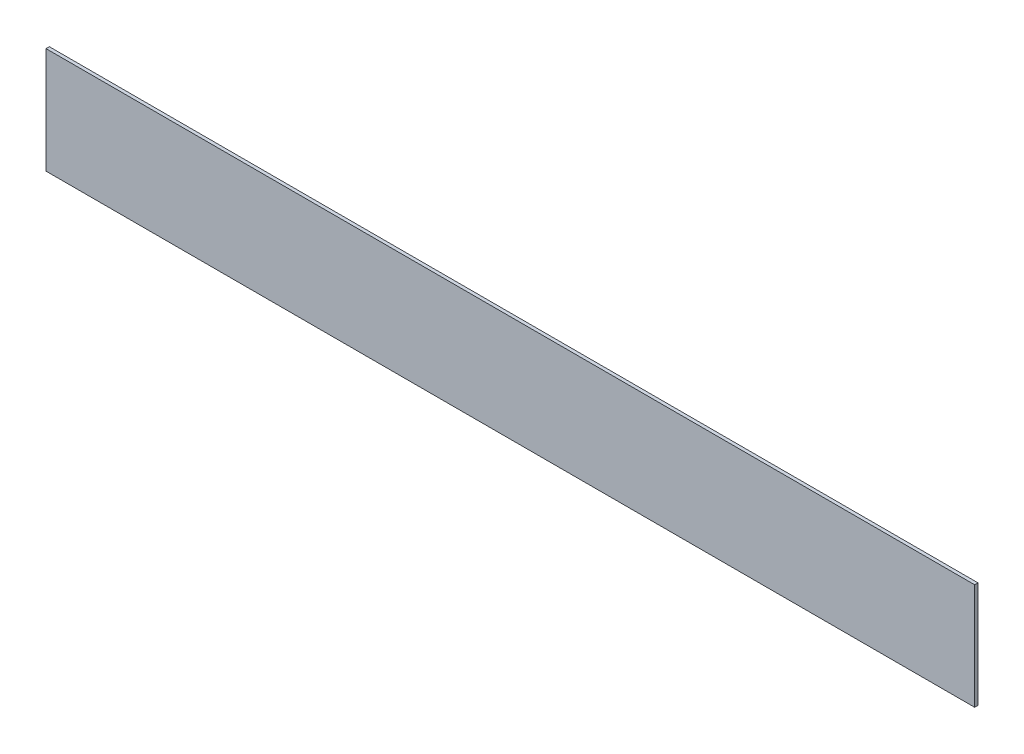
ISO-10303-21;
HEADER;
FILE_DESCRIPTION(('STEP AP214'),'2;1');
FILE_NAME('part.step','',(''),(''),'','','');
FILE_SCHEMA(('AUTOMOTIVE_DESIGN { 1 0 10303 214 1 1 1 1 }'));
ENDSEC;
DATA;
#1=APPLICATION_CONTEXT('core data for automotive mechanical design processes');
#2=APPLICATION_PROTOCOL_DEFINITION('international standard','automotive_design',2000,#1);
#3=PRODUCT_CONTEXT('',#1,'mechanical');
#4=PRODUCT('Part','Part','',(#3));
#5=PRODUCT_RELATED_PRODUCT_CATEGORY('part','',(#4));
#6=PRODUCT_DEFINITION_FORMATION('','',#4);
#7=PRODUCT_DEFINITION_CONTEXT('part definition',#1,'design');
#8=PRODUCT_DEFINITION('design','',#6,#7);
#9=PRODUCT_DEFINITION_SHAPE('','',#8);
#10=(LENGTH_UNIT() NAMED_UNIT(*) SI_UNIT(.MILLI.,.METRE.));
#11=(NAMED_UNIT(*) PLANE_ANGLE_UNIT() SI_UNIT($,.RADIAN.));
#12=(NAMED_UNIT(*) SI_UNIT($,.STERADIAN.) SOLID_ANGLE_UNIT());
#13=UNCERTAINTY_MEASURE_WITH_UNIT(LENGTH_MEASURE(1.E-05),#10,'distance_accuracy_value','');
#14=(GEOMETRIC_REPRESENTATION_CONTEXT(3) GLOBAL_UNCERTAINTY_ASSIGNED_CONTEXT((#13)) GLOBAL_UNIT_ASSIGNED_CONTEXT((#10,
#11,#12)) REPRESENTATION_CONTEXT('',''));
#15=CARTESIAN_POINT('',(0.,0.,0.));
#16=DIRECTION('',(0.,0.,1.));
#17=DIRECTION('',(1.,0.,0.));
#18=AXIS2_PLACEMENT_3D('',#15,#16,#17);
#19=CARTESIAN_POINT('',(0.,0.,1.5875));
#20=DIRECTION('',(-1.,0.,0.));
#21=DIRECTION('',(0.,0.,1.));
#22=AXIS2_PLACEMENT_3D('',#19,#20,#21);
#23=PLANE('',#22);
#24=DIRECTION('',(0.,1.,0.));
#25=VECTOR('',#24,1.);
#26=CARTESIAN_POINT('',(0.,0.,0.));
#27=LINE('',#26,#25);
#28=CARTESIAN_POINT('',(0.,-50.8,0.));
#29=VERTEX_POINT('',#28);
#30=CARTESIAN_POINT('',(0.,0.,0.));
#31=VERTEX_POINT('',#30);
#32=EDGE_CURVE('E96',#29,#31,#27,.T.);
#33=ORIENTED_EDGE('',*,*,#32,.T.);
#34=DIRECTION('',(0.,0.,-1.));
#35=VECTOR('',#34,1.);
#36=CARTESIAN_POINT('',(0.,0.,1.5875));
#37=LINE('',#36,#35);
#38=CARTESIAN_POINT('',(0.,0.,1.5875));
#39=VERTEX_POINT('',#38);
#40=EDGE_CURVE('E11',#39,#31,#37,.T.);
#41=ORIENTED_EDGE('',*,*,#40,.F.);
#42=DIRECTION('',(0.,1.,0.));
#43=VECTOR('',#42,1.);
#44=CARTESIAN_POINT('',(0.,0.,1.5875));
#45=LINE('',#44,#43);
#46=CARTESIAN_POINT('',(0.,-50.8,1.5875));
#47=VERTEX_POINT('',#46);
#48=EDGE_CURVE('E84',#47,#39,#45,.T.);
#49=ORIENTED_EDGE('',*,*,#48,.F.);
#50=DIRECTION('',(0.,0.,-1.));
#51=VECTOR('',#50,1.);
#52=CARTESIAN_POINT('',(0.,-50.8,1.5875));
#53=LINE('',#52,#51);
#54=EDGE_CURVE('E92',#47,#29,#53,.T.);
#55=ORIENTED_EDGE('',*,*,#54,.T.);
#56=EDGE_LOOP('',(#33,#41,#49,#55));
#57=FACE_BOUND('',#56,.T.);
#58=ADVANCED_FACE('F33',(#57),#23,.F.);
#59=CARTESIAN_POINT('',(0.,0.,1.5875));
#60=DIRECTION('',(0.,-1.,0.));
#61=DIRECTION('',(1.,0.,0.));
#62=AXIS2_PLACEMENT_3D('',#59,#60,#61);
#63=PLANE('',#62);
#64=DIRECTION('',(-1.,0.,0.));
#65=VECTOR('',#64,1.);
#66=CARTESIAN_POINT('',(0.,0.,0.));
#67=LINE('',#66,#65);
#68=CARTESIAN_POINT('',(-444.5,0.,0.));
#69=VERTEX_POINT('',#68);
#70=EDGE_CURVE('E88',#31,#69,#67,.T.);
#71=ORIENTED_EDGE('',*,*,#70,.T.);
#72=DIRECTION('',(0.,0.,-1.));
#73=VECTOR('',#72,1.);
#74=CARTESIAN_POINT('',(-444.5,0.,1.5875));
#75=LINE('',#74,#73);
#76=CARTESIAN_POINT('',(-444.5,0.,1.5875));
#77=VERTEX_POINT('',#76);
#78=EDGE_CURVE('E41',#77,#69,#75,.T.);
#79=ORIENTED_EDGE('',*,*,#78,.F.);
#80=DIRECTION('',(-1.,0.,0.));
#81=VECTOR('',#80,1.);
#82=CARTESIAN_POINT('',(0.,0.,1.5875));
#83=LINE('',#82,#81);
#84=EDGE_CURVE('E79',#39,#77,#83,.T.);
#85=ORIENTED_EDGE('',*,*,#84,.F.);
#86=ORIENTED_EDGE('',*,*,#40,.T.);
#87=EDGE_LOOP('',(#71,#79,#85,#86));
#88=FACE_BOUND('',#87,.T.);
#89=ADVANCED_FACE('F87',(#88),#63,.F.);
#90=CARTESIAN_POINT('',(-444.5,0.,1.5875));
#91=DIRECTION('',(1.,0.,0.));
#92=DIRECTION('',(0.,0.,-1.));
#93=AXIS2_PLACEMENT_3D('',#90,#91,#92);
#94=PLANE('',#93);
#95=DIRECTION('',(0.,-1.,0.));
#96=VECTOR('',#95,1.);
#97=CARTESIAN_POINT('',(-444.5,0.,0.));
#98=LINE('',#97,#96);
#99=CARTESIAN_POINT('',(-444.5,-50.8,0.));
#100=VERTEX_POINT('',#99);
#101=EDGE_CURVE('E66',#69,#100,#98,.T.);
#102=ORIENTED_EDGE('',*,*,#101,.T.);
#103=DIRECTION('',(0.,0.,-1.));
#104=VECTOR('',#103,1.);
#105=CARTESIAN_POINT('',(-444.5,-50.8,1.5875));
#106=LINE('',#105,#104);
#107=CARTESIAN_POINT('',(-444.5,-50.8,1.5875));
#108=VERTEX_POINT('',#107);
#109=EDGE_CURVE('E89',#108,#100,#106,.T.);
#110=ORIENTED_EDGE('',*,*,#109,.F.);
#111=DIRECTION('',(0.,-1.,0.));
#112=VECTOR('',#111,1.);
#113=CARTESIAN_POINT('',(-444.5,0.,1.5875));
#114=LINE('',#113,#112);
#115=EDGE_CURVE('E82',#77,#108,#114,.T.);
#116=ORIENTED_EDGE('',*,*,#115,.F.);
#117=ORIENTED_EDGE('',*,*,#78,.T.);
#118=EDGE_LOOP('',(#102,#110,#116,#117));
#119=FACE_BOUND('',#118,.T.);
#120=ADVANCED_FACE('F90',(#119),#94,.F.);
#121=CARTESIAN_POINT('',(0.,-50.8,1.5875));
#122=DIRECTION('',(0.,1.,0.));
#123=DIRECTION('',(-1.,0.,0.));
#124=AXIS2_PLACEMENT_3D('',#121,#122,#123);
#125=PLANE('',#124);
#126=DIRECTION('',(1.,0.,0.));
#127=VECTOR('',#126,1.);
#128=CARTESIAN_POINT('',(0.,-50.8,0.));
#129=LINE('',#128,#127);
#130=EDGE_CURVE('E72',#100,#29,#129,.T.);
#131=ORIENTED_EDGE('',*,*,#130,.T.);
#132=ORIENTED_EDGE('',*,*,#54,.F.);
#133=DIRECTION('',(1.,0.,0.));
#134=VECTOR('',#133,1.);
#135=CARTESIAN_POINT('',(0.,-50.8,1.5875));
#136=LINE('',#135,#134);
#137=EDGE_CURVE('E49',#108,#47,#136,.T.);
#138=ORIENTED_EDGE('',*,*,#137,.F.);
#139=ORIENTED_EDGE('',*,*,#109,.T.);
#140=EDGE_LOOP('',(#131,#132,#138,#139));
#141=FACE_BOUND('',#140,.T.);
#142=ADVANCED_FACE('F103',(#141),#125,.F.);
#143=CARTESIAN_POINT('',(0.,0.,1.5875));
#144=DIRECTION('',(0.,0.,-1.));
#145=DIRECTION('',(-1.,0.,0.));
#146=AXIS2_PLACEMENT_3D('',#143,#144,#145);
#147=PLANE('',#146);
#148=ORIENTED_EDGE('',*,*,#48,.T.);
#149=ORIENTED_EDGE('',*,*,#84,.T.);
#150=ORIENTED_EDGE('',*,*,#115,.T.);
#151=ORIENTED_EDGE('',*,*,#137,.T.);
#152=EDGE_LOOP('',(#148,#149,#150,#151));
#153=FACE_BOUND('',#152,.T.);
#154=ADVANCED_FACE('F80',(#153),#147,.F.);
#155=CARTESIAN_POINT('',(0.,0.,0.));
#156=DIRECTION('',(0.,0.,-1.));
#157=DIRECTION('',(-1.,0.,0.));
#158=AXIS2_PLACEMENT_3D('',#155,#156,#157);
#159=PLANE('',#158);
#160=ORIENTED_EDGE('',*,*,#32,.F.);
#161=ORIENTED_EDGE('',*,*,#130,.F.);
#162=ORIENTED_EDGE('',*,*,#101,.F.);
#163=ORIENTED_EDGE('',*,*,#70,.F.);
#164=EDGE_LOOP('',(#160,#161,#162,#163));
#165=FACE_BOUND('',#164,.T.);
#166=ADVANCED_FACE('F106',(#165),#159,.T.);
#167=CLOSED_SHELL('',(#58,#89,#120,#142,#154,#166));
#168=MANIFOLD_SOLID_BREP('B2',#167);
#169=ADVANCED_BREP_SHAPE_REPRESENTATION('',(#18,#168),#14);
#170=SHAPE_DEFINITION_REPRESENTATION(#9,#169);
ENDSEC;
END-ISO-10303-21;
